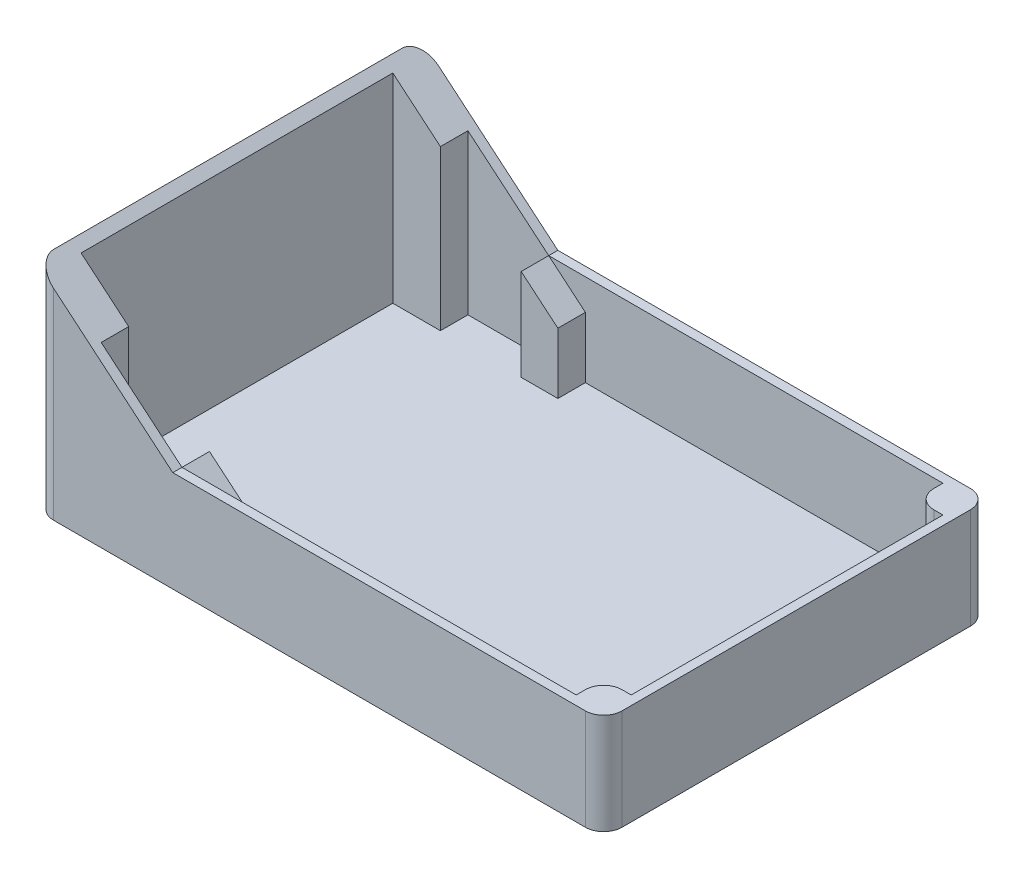
ISO-10303-21;
HEADER;
FILE_DESCRIPTION(('STEP AP214'),'2;1');
FILE_NAME('part.step','',(''),(''),'','','');
FILE_SCHEMA(('AUTOMOTIVE_DESIGN { 1 0 10303 214 1 1 1 1 }'));
ENDSEC;
DATA;
#1=APPLICATION_CONTEXT('core data for automotive mechanical design processes');
#2=APPLICATION_PROTOCOL_DEFINITION('international standard','automotive_design',2000,#1);
#3=PRODUCT_CONTEXT('',#1,'mechanical');
#4=PRODUCT('Part','Part','',(#3));
#5=PRODUCT_RELATED_PRODUCT_CATEGORY('part','',(#4));
#6=PRODUCT_DEFINITION_FORMATION('','',#4);
#7=PRODUCT_DEFINITION_CONTEXT('part definition',#1,'design');
#8=PRODUCT_DEFINITION('design','',#6,#7);
#9=PRODUCT_DEFINITION_SHAPE('','',#8);
#10=(LENGTH_UNIT() NAMED_UNIT(*) SI_UNIT(.MILLI.,.METRE.));
#11=(NAMED_UNIT(*) PLANE_ANGLE_UNIT() SI_UNIT($,.RADIAN.));
#12=(NAMED_UNIT(*) SI_UNIT($,.STERADIAN.) SOLID_ANGLE_UNIT());
#13=UNCERTAINTY_MEASURE_WITH_UNIT(LENGTH_MEASURE(1.E-05),#10,'distance_accuracy_value','');
#14=(GEOMETRIC_REPRESENTATION_CONTEXT(3) GLOBAL_UNCERTAINTY_ASSIGNED_CONTEXT((#13)) GLOBAL_UNIT_ASSIGNED_CONTEXT((#10,
#11,#12)) REPRESENTATION_CONTEXT('',''));
#15=CARTESIAN_POINT('',(0.,0.,0.));
#16=DIRECTION('',(0.,0.,1.));
#17=DIRECTION('',(1.,0.,0.));
#18=AXIS2_PLACEMENT_3D('',#15,#16,#17);
#19=CARTESIAN_POINT('',(0.,0.,-34.));
#20=DIRECTION('',(0.,0.,-1.));
#21=DIRECTION('',(-1.,0.,0.));
#22=AXIS2_PLACEMENT_3D('',#19,#20,#21);
#23=PLANE('',#22);
#24=DIRECTION('',(0.766044443118981,-0.642787609686535,0.));
#25=VECTOR('',#24,1.);
#26=CARTESIAN_POINT('',(-62.,45.1729889353181,-34.));
#27=LINE('',#26,#25);
#28=CARTESIAN_POINT('',(-60.,43.4947896729635,-34.));
#29=VERTEX_POINT('',#28);
#30=CARTESIAN_POINT('',(-49.6190221917366,34.7841150227903,-34.));
#31=VERTEX_POINT('',#30);
#32=EDGE_CURVE('E361',#29,#31,#27,.T.);
#33=ORIENTED_EDGE('',*,*,#32,.F.);
#34=DIRECTION('',(0.,1.,0.));
#35=VECTOR('',#34,1.);
#36=CARTESIAN_POINT('',(-60.,20.,-34.));
#37=LINE('',#36,#35);
#38=CARTESIAN_POINT('',(-60.,0.,-34.));
#39=VERTEX_POINT('',#38);
#40=EDGE_CURVE('E371',#39,#29,#37,.T.);
#41=ORIENTED_EDGE('',*,*,#40,.F.);
#42=DIRECTION('',(1.,0.,0.));
#43=VECTOR('',#42,1.);
#44=CARTESIAN_POINT('',(0.,0.,-34.));
#45=LINE('',#44,#43);
#46=CARTESIAN_POINT('',(-49.6190221917366,0.,-34.));
#47=VERTEX_POINT('',#46);
#48=EDGE_CURVE('E374',#39,#47,#45,.T.);
#49=ORIENTED_EDGE('',*,*,#48,.T.);
#50=DIRECTION('',(0.,-1.,0.));
#51=VECTOR('',#50,1.);
#52=CARTESIAN_POINT('',(-49.6190221917366,34.7841150227903,-34.));
#53=LINE('',#52,#51);
#54=EDGE_CURVE('E357',#31,#47,#53,.T.);
#55=ORIENTED_EDGE('',*,*,#54,.F.);
#56=EDGE_LOOP('',(#33,#41,#49,#55));
#57=FACE_BOUND('',#56,.T.);
#58=ADVANCED_FACE('F62',(#57),#23,.F.);
#59=CARTESIAN_POINT('',(0.,0.,34.));
#60=DIRECTION('',(0.,0.,1.));
#61=DIRECTION('',(-1.,0.,0.));
#62=AXIS2_PLACEMENT_3D('',#59,#60,#61);
#63=PLANE('',#62);
#64=DIRECTION('',(0.,-1.,0.));
#65=VECTOR('',#64,1.);
#66=CARTESIAN_POINT('',(-60.,20.,34.));
#67=LINE('',#66,#65);
#68=CARTESIAN_POINT('',(-60.,43.4947896729635,34.));
#69=VERTEX_POINT('',#68);
#70=CARTESIAN_POINT('',(-60.,0.,34.));
#71=VERTEX_POINT('',#70);
#72=EDGE_CURVE('E273',#69,#71,#67,.T.);
#73=ORIENTED_EDGE('',*,*,#72,.F.);
#74=DIRECTION('',(0.766044443118981,-0.642787609686535,0.));
#75=VECTOR('',#74,1.);
#76=CARTESIAN_POINT('',(-62.,45.1729889353181,34.));
#77=LINE('',#76,#75);
#78=CARTESIAN_POINT('',(-49.6190221917366,34.7841150227903,34.));
#79=VERTEX_POINT('',#78);
#80=EDGE_CURVE('E267',#69,#79,#77,.T.);
#81=ORIENTED_EDGE('',*,*,#80,.T.);
#82=DIRECTION('',(0.,-1.,0.));
#83=VECTOR('',#82,1.);
#84=CARTESIAN_POINT('',(-49.6190221917366,34.7841150227903,34.));
#85=LINE('',#84,#83);
#86=CARTESIAN_POINT('',(-49.6190221917366,0.,34.));
#87=VERTEX_POINT('',#86);
#88=EDGE_CURVE('E272',#79,#87,#85,.T.);
#89=ORIENTED_EDGE('',*,*,#88,.T.);
#90=DIRECTION('',(-1.,0.,0.));
#91=VECTOR('',#90,1.);
#92=CARTESIAN_POINT('',(0.,0.,34.));
#93=LINE('',#92,#91);
#94=EDGE_CURVE('E287',#87,#71,#93,.T.);
#95=ORIENTED_EDGE('',*,*,#94,.T.);
#96=EDGE_LOOP('',(#73,#81,#89,#95));
#97=FACE_BOUND('',#96,.T.);
#98=ADVANCED_FACE('F269',(#97),#63,.F.);
#99=CARTESIAN_POINT('',(-60.,20.,40.));
#100=DIRECTION('',(0.,0.,-1.));
#101=DIRECTION('',(-1.,0.,0.));
#102=AXIS2_PLACEMENT_3D('',#99,#100,#101);
#103=PLANE('',#102);
#104=DIRECTION('',(1.,0.,0.));
#105=VECTOR('',#104,1.);
#106=CARTESIAN_POINT('',(-60.,0.,40.));
#107=LINE('',#106,#105);
#108=CARTESIAN_POINT('',(-49.6190221917366,0.,40.));
#109=VERTEX_POINT('',#108);
#110=CARTESIAN_POINT('',(-32.,0.,40.));
#111=VERTEX_POINT('',#110);
#112=EDGE_CURVE('E500',#109,#111,#107,.T.);
#113=ORIENTED_EDGE('',*,*,#112,.F.);
#114=DIRECTION('',(0.,-1.,0.));
#115=VECTOR('',#114,1.);
#116=CARTESIAN_POINT('',(-49.6190221917366,34.7841150227903,40.));
#117=LINE('',#116,#115);
#118=CARTESIAN_POINT('',(-49.6190221917366,34.7841150227903,40.));
#119=VERTEX_POINT('',#118);
#120=EDGE_CURVE('E293',#119,#109,#117,.T.);
#121=ORIENTED_EDGE('',*,*,#120,.F.);
#122=DIRECTION('',(0.766044443118982,-0.642787609686535,0.));
#123=VECTOR('',#122,1.);
#124=CARTESIAN_POINT('',(-62.,45.1729889353181,40.));
#125=LINE('',#124,#123);
#126=CARTESIAN_POINT('',(-32.,20.,40.));
#127=VERTEX_POINT('',#126);
#128=EDGE_CURVE('E282',#119,#127,#125,.T.);
#129=ORIENTED_EDGE('',*,*,#128,.T.);
#130=DIRECTION('',(0.,-1.,0.));
#131=VECTOR('',#130,1.);
#132=CARTESIAN_POINT('',(-32.,20.,40.));
#133=LINE('',#132,#131);
#134=EDGE_CURVE('E315',#127,#111,#133,.T.);
#135=ORIENTED_EDGE('',*,*,#134,.T.);
#136=EDGE_LOOP('',(#113,#121,#129,#135));
#137=FACE_BOUND('',#136,.T.);
#138=ADVANCED_FACE('F732',(#137),#103,.T.);
#139=CARTESIAN_POINT('',(-60.,20.,-40.));
#140=DIRECTION('',(1.,0.,0.));
#141=DIRECTION('',(0.,0.,-1.));
#142=AXIS2_PLACEMENT_3D('',#139,#140,#141);
#143=PLANE('',#142);
#144=ORIENTED_EDGE('',*,*,#40,.T.);
#145=DIRECTION('',(0.,0.,-1.));
#146=VECTOR('',#145,1.);
#147=CARTESIAN_POINT('',(-60.,43.4947896729635,59.252314189746));
#148=LINE('',#147,#146);
#149=EDGE_CURVE('E296',#69,#29,#148,.T.);
#150=ORIENTED_EDGE('',*,*,#149,.F.);
#151=ORIENTED_EDGE('',*,*,#72,.T.);
#152=DIRECTION('',(0.,0.,1.));
#153=VECTOR('',#152,1.);
#154=CARTESIAN_POINT('',(-60.,0.,-40.));
#155=LINE('',#154,#153);
#156=EDGE_CURVE('E516',#39,#71,#155,.T.);
#157=ORIENTED_EDGE('',*,*,#156,.F.);
#158=EDGE_LOOP('',(#144,#150,#151,#157));
#159=FACE_BOUND('',#158,.T.);
#160=ADVANCED_FACE('F763',(#159),#143,.T.);
#161=CARTESIAN_POINT('',(0.,0.,0.));
#162=DIRECTION('',(0.,-1.,0.));
#163=DIRECTION('',(0.,0.,-1.));
#164=AXIS2_PLACEMENT_3D('',#161,#162,#163);
#165=PLANE('',#164);
#166=DIRECTION('',(0.,0.,-1.));
#167=VECTOR('',#166,1.);
#168=CARTESIAN_POINT('',(-49.6190221917366,0.,0.));
#169=LINE('',#168,#167);
#170=EDGE_CURVE('E291',#109,#87,#169,.T.);
#171=ORIENTED_EDGE('',*,*,#170,.F.);
#172=ORIENTED_EDGE('',*,*,#112,.T.);
#173=DIRECTION('',(0.,0.,-1.));
#174=VECTOR('',#173,1.);
#175=CARTESIAN_POINT('',(-32.,0.,0.));
#176=LINE('',#175,#174);
#177=CARTESIAN_POINT('',(-32.,0.,34.));
#178=VERTEX_POINT('',#177);
#179=EDGE_CURVE('E353',#111,#178,#176,.T.);
#180=ORIENTED_EDGE('',*,*,#179,.T.);
#181=DIRECTION('',(-1.,0.,0.));
#182=VECTOR('',#181,1.);
#183=CARTESIAN_POINT('',(0.,0.,34.));
#184=LINE('',#183,#182);
#185=CARTESIAN_POINT('',(-24.,0.,34.));
#186=VERTEX_POINT('',#185);
#187=EDGE_CURVE('E345',#186,#178,#184,.T.);
#188=ORIENTED_EDGE('',*,*,#187,.F.);
#189=DIRECTION('',(0.,0.,1.));
#190=VECTOR('',#189,1.);
#191=CARTESIAN_POINT('',(-24.,0.,0.));
#192=LINE('',#191,#190);
#193=CARTESIAN_POINT('',(-24.,0.,40.));
#194=VERTEX_POINT('',#193);
#195=EDGE_CURVE('E349',#186,#194,#192,.T.);
#196=ORIENTED_EDGE('',*,*,#195,.T.);
#197=CARTESIAN_POINT('',(54.,0.,40.));
#198=VERTEX_POINT('',#197);
#199=EDGE_CURVE('E520',#194,#198,#107,.T.);
#200=ORIENTED_EDGE('',*,*,#199,.T.);
#201=DIRECTION('',(0.,0.,1.));
#202=VECTOR('',#201,1.);
#203=CARTESIAN_POINT('',(54.,0.,40.));
#204=LINE('',#203,#202);
#205=CARTESIAN_POINT('',(54.,0.,38.));
#206=VERTEX_POINT('',#205);
#207=EDGE_CURVE('E405',#206,#198,#204,.T.);
#208=ORIENTED_EDGE('',*,*,#207,.F.);
#209=CARTESIAN_POINT('',(58.,0.,38.));
#210=DIRECTION('',(0.,-1.,0.));
#211=DIRECTION('',(0.,0.,-1.));
#212=AXIS2_PLACEMENT_3D('',#209,#210,#211);
#213=CIRCLE('',#212,4.);
#214=CARTESIAN_POINT('',(58.,0.,34.));
#215=VERTEX_POINT('',#214);
#216=EDGE_CURVE('E12',#206,#215,#213,.T.);
#217=ORIENTED_EDGE('',*,*,#216,.T.);
#218=DIRECTION('',(-1.,0.,0.));
#219=VECTOR('',#218,1.);
#220=CARTESIAN_POINT('',(60.,0.,34.));
#221=LINE('',#220,#219);
#222=CARTESIAN_POINT('',(60.,0.,34.));
#223=VERTEX_POINT('',#222);
#224=EDGE_CURVE('E398',#223,#215,#221,.T.);
#225=ORIENTED_EDGE('',*,*,#224,.F.);
#226=DIRECTION('',(0.,0.,-1.));
#227=VECTOR('',#226,1.);
#228=CARTESIAN_POINT('',(60.,0.,-40.));
#229=LINE('',#228,#227);
#230=CARTESIAN_POINT('',(60.,0.,-34.));
#231=VERTEX_POINT('',#230);
#232=EDGE_CURVE('E494',#223,#231,#229,.T.);
#233=ORIENTED_EDGE('',*,*,#232,.T.);
#234=DIRECTION('',(1.,0.,0.));
#235=VECTOR('',#234,1.);
#236=CARTESIAN_POINT('',(60.,0.,-34.));
#237=LINE('',#236,#235);
#238=CARTESIAN_POINT('',(58.,0.,-34.));
#239=VERTEX_POINT('',#238);
#240=EDGE_CURVE('E423',#239,#231,#237,.T.);
#241=ORIENTED_EDGE('',*,*,#240,.F.);
#242=CARTESIAN_POINT('',(58.,0.,-38.));
#243=DIRECTION('',(0.,-1.,0.));
#244=DIRECTION('',(0.,0.,-1.));
#245=AXIS2_PLACEMENT_3D('',#242,#243,#244);
#246=CIRCLE('',#245,4.);
#247=CARTESIAN_POINT('',(54.,0.,-38.));
#248=VERTEX_POINT('',#247);
#249=EDGE_CURVE('E71',#239,#248,#246,.T.);
#250=ORIENTED_EDGE('',*,*,#249,.T.);
#251=DIRECTION('',(0.,0.,1.));
#252=VECTOR('',#251,1.);
#253=CARTESIAN_POINT('',(54.,0.,-40.));
#254=LINE('',#253,#252);
#255=CARTESIAN_POINT('',(54.,0.,-40.));
#256=VERTEX_POINT('',#255);
#257=EDGE_CURVE('E427',#256,#248,#254,.T.);
#258=ORIENTED_EDGE('',*,*,#257,.F.);
#259=DIRECTION('',(-1.,0.,0.));
#260=VECTOR('',#259,1.);
#261=CARTESIAN_POINT('',(-60.,0.,-40.));
#262=LINE('',#261,#260);
#263=CARTESIAN_POINT('',(-24.,0.,-40.));
#264=VERTEX_POINT('',#263);
#265=EDGE_CURVE('E513',#256,#264,#262,.T.);
#266=ORIENTED_EDGE('',*,*,#265,.T.);
#267=DIRECTION('',(0.,0.,-1.));
#268=VECTOR('',#267,1.);
#269=CARTESIAN_POINT('',(-24.,0.,0.));
#270=LINE('',#269,#268);
#271=CARTESIAN_POINT('',(-24.,0.,-34.));
#272=VERTEX_POINT('',#271);
#273=EDGE_CURVE('E470',#272,#264,#270,.T.);
#274=ORIENTED_EDGE('',*,*,#273,.F.);
#275=DIRECTION('',(1.,0.,0.));
#276=VECTOR('',#275,1.);
#277=CARTESIAN_POINT('',(0.,0.,-34.));
#278=LINE('',#277,#276);
#279=CARTESIAN_POINT('',(-32.,0.,-34.));
#280=VERTEX_POINT('',#279);
#281=EDGE_CURVE('E466',#280,#272,#278,.T.);
#282=ORIENTED_EDGE('',*,*,#281,.F.);
#283=DIRECTION('',(0.,0.,1.));
#284=VECTOR('',#283,1.);
#285=CARTESIAN_POINT('',(-32.,0.,0.));
#286=LINE('',#285,#284);
#287=CARTESIAN_POINT('',(-32.,0.,-40.));
#288=VERTEX_POINT('',#287);
#289=EDGE_CURVE('E474',#288,#280,#286,.T.);
#290=ORIENTED_EDGE('',*,*,#289,.F.);
#291=CARTESIAN_POINT('',(-49.6190221917366,0.,-40.));
#292=VERTEX_POINT('',#291);
#293=EDGE_CURVE('E512',#288,#292,#262,.T.);
#294=ORIENTED_EDGE('',*,*,#293,.T.);
#295=DIRECTION('',(0.,0.,1.));
#296=VECTOR('',#295,1.);
#297=CARTESIAN_POINT('',(-49.6190221917366,0.,0.));
#298=LINE('',#297,#296);
#299=EDGE_CURVE('E377',#292,#47,#298,.T.);
#300=ORIENTED_EDGE('',*,*,#299,.T.);
#301=ORIENTED_EDGE('',*,*,#48,.F.);
#302=ORIENTED_EDGE('',*,*,#156,.T.);
#303=ORIENTED_EDGE('',*,*,#94,.F.);
#304=EDGE_LOOP('',(#171,#172,#180,#188,#196,#200,#208,#217,#225,#233,#241,#250,#258,#266,#274,
#282,#290,#294,#300,#301,#302,#303));
#305=FACE_BOUND('',#304,.T.);
#306=ADVANCED_FACE('F607',(#305),#165,.F.);
#307=CARTESIAN_POINT('',(0.,20.,0.));
#308=DIRECTION('',(0.,1.,0.));
#309=DIRECTION('',(0.,0.,1.));
#310=AXIS2_PLACEMENT_3D('',#307,#308,#309);
#311=PLANE('',#310);
#312=DIRECTION('',(0.,0.,1.));
#313=VECTOR('',#312,1.);
#314=CARTESIAN_POINT('',(54.,20.,-40.));
#315=LINE('',#314,#313);
#316=CARTESIAN_POINT('',(54.,20.,-40.));
#317=VERTEX_POINT('',#316);
#318=CARTESIAN_POINT('',(54.,20.,-38.));
#319=VERTEX_POINT('',#318);
#320=EDGE_CURVE('E415',#317,#319,#315,.T.);
#321=ORIENTED_EDGE('',*,*,#320,.T.);
#322=CARTESIAN_POINT('',(58.,20.,-38.));
#323=DIRECTION('',(0.,1.,0.));
#324=DIRECTION('',(0.,0.,1.));
#325=AXIS2_PLACEMENT_3D('',#322,#323,#324);
#326=CIRCLE('',#325,4.);
#327=CARTESIAN_POINT('',(58.,20.,-34.));
#328=VERTEX_POINT('',#327);
#329=EDGE_CURVE('E547',#319,#328,#326,.T.);
#330=ORIENTED_EDGE('',*,*,#329,.T.);
#331=DIRECTION('',(1.,0.,0.));
#332=VECTOR('',#331,1.);
#333=CARTESIAN_POINT('',(60.,20.,-34.));
#334=LINE('',#333,#332);
#335=CARTESIAN_POINT('',(60.,20.,-34.));
#336=VERTEX_POINT('',#335);
#337=EDGE_CURVE('E416',#328,#336,#334,.T.);
#338=ORIENTED_EDGE('',*,*,#337,.T.);
#339=DIRECTION('',(0.,0.,-1.));
#340=VECTOR('',#339,1.);
#341=CARTESIAN_POINT('',(60.,20.,-40.));
#342=LINE('',#341,#340);
#343=CARTESIAN_POINT('',(60.,20.,34.));
#344=VERTEX_POINT('',#343);
#345=EDGE_CURVE('E495',#344,#336,#342,.T.);
#346=ORIENTED_EDGE('',*,*,#345,.F.);
#347=DIRECTION('',(-1.,0.,0.));
#348=VECTOR('',#347,1.);
#349=CARTESIAN_POINT('',(60.,20.,34.));
#350=LINE('',#349,#348);
#351=CARTESIAN_POINT('',(58.,20.,34.));
#352=VERTEX_POINT('',#351);
#353=EDGE_CURVE('E392',#344,#352,#350,.T.);
#354=ORIENTED_EDGE('',*,*,#353,.T.);
#355=CARTESIAN_POINT('',(58.,20.,38.));
#356=DIRECTION('',(0.,1.,0.));
#357=DIRECTION('',(0.,0.,1.));
#358=AXIS2_PLACEMENT_3D('',#355,#356,#357);
#359=CIRCLE('',#358,4.);
#360=CARTESIAN_POINT('',(54.,20.,38.));
#361=VERTEX_POINT('',#360);
#362=EDGE_CURVE('E544',#352,#361,#359,.T.);
#363=ORIENTED_EDGE('',*,*,#362,.T.);
#364=DIRECTION('',(0.,0.,1.));
#365=VECTOR('',#364,1.);
#366=CARTESIAN_POINT('',(54.,20.,40.));
#367=LINE('',#366,#365);
#368=CARTESIAN_POINT('',(54.,20.,40.));
#369=VERTEX_POINT('',#368);
#370=EDGE_CURVE('E395',#361,#369,#367,.T.);
#371=ORIENTED_EDGE('',*,*,#370,.T.);
#372=DIRECTION('',(1.,0.,0.));
#373=VECTOR('',#372,1.);
#374=CARTESIAN_POINT('',(-60.,20.,40.));
#375=LINE('',#374,#373);
#376=EDGE_CURVE('E504',#127,#369,#375,.T.);
#377=ORIENTED_EDGE('',*,*,#376,.F.);
#378=DIRECTION('',(0.,0.,1.));
#379=VECTOR('',#378,1.);
#380=CARTESIAN_POINT('',(-32.,20.,40.));
#381=LINE('',#380,#379);
#382=CARTESIAN_POINT('',(-32.,20.,42.));
#383=VERTEX_POINT('',#382);
#384=EDGE_CURVE('E309',#127,#383,#381,.T.);
#385=ORIENTED_EDGE('',*,*,#384,.T.);
#386=DIRECTION('',(1.,0.,0.));
#387=VECTOR('',#386,1.);
#388=CARTESIAN_POINT('',(-60.,20.,42.));
#389=LINE('',#388,#387);
#390=CARTESIAN_POINT('',(58.,20.,42.));
#391=VERTEX_POINT('',#390);
#392=EDGE_CURVE('E530',#383,#391,#389,.T.);
#393=ORIENTED_EDGE('',*,*,#392,.T.);
#394=CARTESIAN_POINT('',(58.,20.,38.));
#395=DIRECTION('',(0.,1.,0.));
#396=DIRECTION('',(0.,0.,1.));
#397=AXIS2_PLACEMENT_3D('',#394,#395,#396);
#398=CIRCLE('',#397,4.);
#399=CARTESIAN_POINT('',(62.,20.,38.));
#400=VERTEX_POINT('',#399);
#401=EDGE_CURVE('E538',#391,#400,#398,.T.);
#402=ORIENTED_EDGE('',*,*,#401,.T.);
#403=DIRECTION('',(0.,0.,-1.));
#404=VECTOR('',#403,1.);
#405=CARTESIAN_POINT('',(62.,20.,-40.));
#406=LINE('',#405,#404);
#407=CARTESIAN_POINT('',(62.,20.,-38.));
#408=VERTEX_POINT('',#407);
#409=EDGE_CURVE('E508',#400,#408,#406,.T.);
#410=ORIENTED_EDGE('',*,*,#409,.T.);
#411=CARTESIAN_POINT('',(58.,20.,-38.));
#412=DIRECTION('',(0.,1.,0.));
#413=DIRECTION('',(0.,0.,1.));
#414=AXIS2_PLACEMENT_3D('',#411,#412,#413);
#415=CIRCLE('',#414,4.);
#416=CARTESIAN_POINT('',(58.,20.,-42.));
#417=VERTEX_POINT('',#416);
#418=EDGE_CURVE('E541',#408,#417,#415,.T.);
#419=ORIENTED_EDGE('',*,*,#418,.T.);
#420=DIRECTION('',(-1.,0.,0.));
#421=VECTOR('',#420,1.);
#422=CARTESIAN_POINT('',(-60.,20.,-42.));
#423=LINE('',#422,#421);
#424=CARTESIAN_POINT('',(-32.,20.,-42.));
#425=VERTEX_POINT('',#424);
#426=EDGE_CURVE('E526',#417,#425,#423,.T.);
#427=ORIENTED_EDGE('',*,*,#426,.T.);
#428=DIRECTION('',(0.,0.,-1.));
#429=VECTOR('',#428,1.);
#430=CARTESIAN_POINT('',(-32.,20.,-40.));
#431=LINE('',#430,#429);
#432=CARTESIAN_POINT('',(-32.,20.,-40.));
#433=VERTEX_POINT('',#432);
#434=EDGE_CURVE('E388',#433,#425,#431,.T.);
#435=ORIENTED_EDGE('',*,*,#434,.F.);
#436=DIRECTION('',(-1.,0.,0.));
#437=VECTOR('',#436,1.);
#438=CARTESIAN_POINT('',(-60.,20.,-40.));
#439=LINE('',#438,#437);
#440=EDGE_CURVE('E499',#317,#433,#439,.T.);
#441=ORIENTED_EDGE('',*,*,#440,.F.);
#442=EDGE_LOOP('',(#321,#330,#338,#346,#354,#363,#371,#377,#385,#393,#402,#410,#419,#427,#435,#441));
#443=FACE_BOUND('',#442,.T.);
#444=ADVANCED_FACE('F619',(#443),#311,.T.);
#445=CARTESIAN_POINT('',(-60.,20.,-40.));
#446=DIRECTION('',(0.,0.,1.));
#447=DIRECTION('',(1.,0.,0.));
#448=AXIS2_PLACEMENT_3D('',#445,#446,#447);
#449=PLANE('',#448);
#450=DIRECTION('',(0.,-1.,0.));
#451=VECTOR('',#450,1.);
#452=CARTESIAN_POINT('',(-49.6190221917366,34.7841150227903,-40.));
#453=LINE('',#452,#451);
#454=CARTESIAN_POINT('',(-49.6190221917366,34.7841150227903,-40.));
#455=VERTEX_POINT('',#454);
#456=EDGE_CURVE('E356',#455,#292,#453,.T.);
#457=ORIENTED_EDGE('',*,*,#456,.T.);
#458=ORIENTED_EDGE('',*,*,#293,.F.);
#459=DIRECTION('',(0.,-1.,0.));
#460=VECTOR('',#459,1.);
#461=CARTESIAN_POINT('',(-32.,20.,-40.));
#462=LINE('',#461,#460);
#463=EDGE_CURVE('E434',#433,#288,#462,.T.);
#464=ORIENTED_EDGE('',*,*,#463,.F.);
#465=DIRECTION('',(0.766044443118982,-0.642787609686535,0.));
#466=VECTOR('',#465,1.);
#467=CARTESIAN_POINT('',(-62.,45.1729889353181,-40.));
#468=LINE('',#467,#466);
#469=EDGE_CURVE('E382',#455,#433,#468,.T.);
#470=ORIENTED_EDGE('',*,*,#469,.F.);
#471=EDGE_LOOP('',(#457,#458,#464,#470));
#472=FACE_BOUND('',#471,.T.);
#473=ADVANCED_FACE('F687',(#472),#449,.T.);
#474=DIRECTION('',(0.,1.,0.));
#475=VECTOR('',#474,1.);
#476=CARTESIAN_POINT('',(54.,-8.48528137423857,-40.));
#477=LINE('',#476,#475);
#478=EDGE_CURVE('E419',#256,#317,#477,.T.);
#479=ORIENTED_EDGE('',*,*,#478,.T.);
#480=ORIENTED_EDGE('',*,*,#440,.T.);
#481=DIRECTION('',(-0.766044443118982,0.642787609686535,0.));
#482=VECTOR('',#481,1.);
#483=CARTESIAN_POINT('',(-32.,20.,-40.));
#484=LINE('',#483,#482);
#485=CARTESIAN_POINT('',(-24.,13.2872029505818,-40.));
#486=VERTEX_POINT('',#485);
#487=EDGE_CURVE('E442',#486,#433,#484,.T.);
#488=ORIENTED_EDGE('',*,*,#487,.F.);
#489=DIRECTION('',(0.,1.,0.));
#490=VECTOR('',#489,1.);
#491=CARTESIAN_POINT('',(-24.,13.2872029505818,-40.));
#492=LINE('',#491,#490);
#493=EDGE_CURVE('E452',#264,#486,#492,.T.);
#494=ORIENTED_EDGE('',*,*,#493,.F.);
#495=ORIENTED_EDGE('',*,*,#265,.F.);
#496=EDGE_LOOP('',(#479,#480,#488,#494,#495));
#497=FACE_BOUND('',#496,.T.);
#498=ADVANCED_FACE('F705',(#497),#449,.T.);
#499=CARTESIAN_POINT('',(62.,20.,-40.));
#500=DIRECTION('',(-1.,0.,0.));
#501=DIRECTION('',(0.,0.,1.));
#502=AXIS2_PLACEMENT_3D('',#499,#500,#501);
#503=PLANE('',#502);
#504=DIRECTION('',(0.,0.,1.));
#505=VECTOR('',#504,1.);
#506=CARTESIAN_POINT('',(62.,-2.,-42.));
#507=LINE('',#506,#505);
#508=CARTESIAN_POINT('',(62.,-2.,-38.));
#509=VERTEX_POINT('',#508);
#510=CARTESIAN_POINT('',(62.,-2.,38.));
#511=VERTEX_POINT('',#510);
#512=EDGE_CURVE('E482',#509,#511,#507,.T.);
#513=ORIENTED_EDGE('',*,*,#512,.F.);
#514=DIRECTION('',(0.,-1.,0.));
#515=VECTOR('',#514,1.);
#516=CARTESIAN_POINT('',(62.,20.,-38.));
#517=LINE('',#516,#515);
#518=EDGE_CURVE('E601',#509,#408,#517,.F.);
#519=ORIENTED_EDGE('',*,*,#518,.T.);
#520=ORIENTED_EDGE('',*,*,#409,.F.);
#521=DIRECTION('',(0.,-1.,0.));
#522=VECTOR('',#521,1.);
#523=CARTESIAN_POINT('',(62.,20.,38.));
#524=LINE('',#523,#522);
#525=EDGE_CURVE('E597',#400,#511,#524,.T.);
#526=ORIENTED_EDGE('',*,*,#525,.T.);
#527=EDGE_LOOP('',(#513,#519,#520,#526));
#528=FACE_BOUND('',#527,.T.);
#529=ADVANCED_FACE('F672',(#528),#503,.F.);
#530=CARTESIAN_POINT('',(-60.,20.,-42.));
#531=DIRECTION('',(0.,0.,1.));
#532=DIRECTION('',(1.,0.,0.));
#533=AXIS2_PLACEMENT_3D('',#530,#531,#532);
#534=PLANE('',#533);
#535=DIRECTION('',(1.,0.,0.));
#536=VECTOR('',#535,1.);
#537=CARTESIAN_POINT('',(-62.,-2.,-42.));
#538=LINE('',#537,#536);
#539=CARTESIAN_POINT('',(-58.,-2.,-42.));
#540=VERTEX_POINT('',#539);
#541=CARTESIAN_POINT('',(58.,-2.,-42.));
#542=VERTEX_POINT('',#541);
#543=EDGE_CURVE('E478',#540,#542,#538,.T.);
#544=ORIENTED_EDGE('',*,*,#543,.F.);
#545=DIRECTION('',(0.,-1.,0.));
#546=VECTOR('',#545,1.);
#547=CARTESIAN_POINT('',(-58.,20.,-42.));
#548=LINE('',#547,#546);
#549=CARTESIAN_POINT('',(-58.,41.816590410609,-42.));
#550=VERTEX_POINT('',#549);
#551=EDGE_CURVE('E78',#540,#550,#548,.F.);
#552=ORIENTED_EDGE('',*,*,#551,.T.);
#553=DIRECTION('',(0.766044443118982,-0.642787609686535,0.));
#554=VECTOR('',#553,1.);
#555=CARTESIAN_POINT('',(-62.,45.1729889353181,-42.));
#556=LINE('',#555,#554);
#557=EDGE_CURVE('E381',#550,#425,#556,.T.);
#558=ORIENTED_EDGE('',*,*,#557,.T.);
#559=ORIENTED_EDGE('',*,*,#426,.F.);
#560=DIRECTION('',(0.,-1.,0.));
#561=VECTOR('',#560,1.);
#562=CARTESIAN_POINT('',(58.,20.,-42.));
#563=LINE('',#562,#561);
#564=EDGE_CURVE('E591',#417,#542,#563,.T.);
#565=ORIENTED_EDGE('',*,*,#564,.T.);
#566=EDGE_LOOP('',(#544,#552,#558,#559,#565));
#567=FACE_BOUND('',#566,.T.);
#568=ADVANCED_FACE('F681',(#567),#534,.F.);
#569=CARTESIAN_POINT('',(-62.,20.,-40.));
#570=DIRECTION('',(1.,0.,0.));
#571=DIRECTION('',(0.,0.,-1.));
#572=AXIS2_PLACEMENT_3D('',#569,#570,#571);
#573=PLANE('',#572);
#574=DIRECTION('',(0.,0.,-1.));
#575=VECTOR('',#574,1.);
#576=CARTESIAN_POINT('',(-62.,-2.,42.));
#577=LINE('',#576,#575);
#578=CARTESIAN_POINT('',(-62.,-2.,38.));
#579=VERTEX_POINT('',#578);
#580=CARTESIAN_POINT('',(-62.,-2.,-38.));
#581=VERTEX_POINT('',#580);
#582=EDGE_CURVE('E490',#579,#581,#577,.T.);
#583=ORIENTED_EDGE('',*,*,#582,.F.);
#584=DIRECTION('',(0.,-1.,0.));
#585=VECTOR('',#584,1.);
#586=CARTESIAN_POINT('',(-62.,20.,38.));
#587=LINE('',#586,#585);
#588=CARTESIAN_POINT('',(-62.,45.1729889353181,38.));
#589=VERTEX_POINT('',#588);
#590=EDGE_CURVE('E583',#579,#589,#587,.F.);
#591=ORIENTED_EDGE('',*,*,#590,.T.);
#592=DIRECTION('',(0.,0.,-1.));
#593=VECTOR('',#592,1.);
#594=CARTESIAN_POINT('',(-62.,45.1729889353181,-40.));
#595=LINE('',#594,#593);
#596=CARTESIAN_POINT('',(-62.,45.1729889353181,-38.));
#597=VERTEX_POINT('',#596);
#598=EDGE_CURVE('E385',#589,#597,#595,.T.);
#599=ORIENTED_EDGE('',*,*,#598,.T.);
#600=DIRECTION('',(0.,-1.,0.));
#601=VECTOR('',#600,1.);
#602=CARTESIAN_POINT('',(-62.,20.,-38.));
#603=LINE('',#602,#601);
#604=EDGE_CURVE('E579',#597,#581,#603,.T.);
#605=ORIENTED_EDGE('',*,*,#604,.T.);
#606=EDGE_LOOP('',(#583,#591,#599,#605));
#607=FACE_BOUND('',#606,.T.);
#608=ADVANCED_FACE('F777',(#607),#573,.F.);
#609=CARTESIAN_POINT('',(-60.,20.,42.));
#610=DIRECTION('',(0.,0.,-1.));
#611=DIRECTION('',(-1.,0.,0.));
#612=AXIS2_PLACEMENT_3D('',#609,#610,#611);
#613=PLANE('',#612);
#614=DIRECTION('',(0.766044443118982,-0.642787609686535,0.));
#615=VECTOR('',#614,1.);
#616=CARTESIAN_POINT('',(-62.,45.1729889353181,42.));
#617=LINE('',#616,#615);
#618=CARTESIAN_POINT('',(-58.,41.816590410609,42.));
#619=VERTEX_POINT('',#618);
#620=EDGE_CURVE('E306',#619,#383,#617,.T.);
#621=ORIENTED_EDGE('',*,*,#620,.F.);
#622=DIRECTION('',(0.,-1.,0.));
#623=VECTOR('',#622,1.);
#624=CARTESIAN_POINT('',(-58.,20.,42.));
#625=LINE('',#624,#623);
#626=CARTESIAN_POINT('',(-58.,-2.,42.));
#627=VERTEX_POINT('',#626);
#628=EDGE_CURVE('E563',#619,#627,#625,.T.);
#629=ORIENTED_EDGE('',*,*,#628,.T.);
#630=DIRECTION('',(-1.,0.,0.));
#631=VECTOR('',#630,1.);
#632=CARTESIAN_POINT('',(62.,-2.,42.));
#633=LINE('',#632,#631);
#634=CARTESIAN_POINT('',(58.,-2.,42.));
#635=VERTEX_POINT('',#634);
#636=EDGE_CURVE('E486',#635,#627,#633,.T.);
#637=ORIENTED_EDGE('',*,*,#636,.F.);
#638=DIRECTION('',(0.,-1.,0.));
#639=VECTOR('',#638,1.);
#640=CARTESIAN_POINT('',(58.,20.,42.));
#641=LINE('',#640,#639);
#642=EDGE_CURVE('E560',#635,#391,#641,.F.);
#643=ORIENTED_EDGE('',*,*,#642,.T.);
#644=ORIENTED_EDGE('',*,*,#392,.F.);
#645=EDGE_LOOP('',(#621,#629,#637,#643,#644));
#646=FACE_BOUND('',#645,.T.);
#647=ADVANCED_FACE('F663',(#646),#613,.F.);
#648=CARTESIAN_POINT('',(60.,20.,-40.));
#649=DIRECTION('',(-1.,0.,0.));
#650=DIRECTION('',(0.,0.,1.));
#651=AXIS2_PLACEMENT_3D('',#648,#649,#650);
#652=PLANE('',#651);
#653=DIRECTION('',(0.,1.,0.));
#654=VECTOR('',#653,1.);
#655=CARTESIAN_POINT('',(60.,-8.48528137423857,34.));
#656=LINE('',#655,#654);
#657=EDGE_CURVE('E412',#223,#344,#656,.T.);
#658=ORIENTED_EDGE('',*,*,#657,.T.);
#659=ORIENTED_EDGE('',*,*,#345,.T.);
#660=DIRECTION('',(0.,1.,0.));
#661=VECTOR('',#660,1.);
#662=CARTESIAN_POINT('',(60.,-8.48528137423857,-34.));
#663=LINE('',#662,#661);
#664=EDGE_CURVE('E426',#231,#336,#663,.T.);
#665=ORIENTED_EDGE('',*,*,#664,.F.);
#666=ORIENTED_EDGE('',*,*,#232,.F.);
#667=EDGE_LOOP('',(#658,#659,#665,#666));
#668=FACE_BOUND('',#667,.T.);
#669=ADVANCED_FACE('F627',(#668),#652,.T.);
#670=DIRECTION('',(-0.766044443118982,0.642787609686535,0.));
#671=VECTOR('',#670,1.);
#672=CARTESIAN_POINT('',(-32.,20.,40.));
#673=LINE('',#672,#671);
#674=CARTESIAN_POINT('',(-24.,13.2872029505818,40.));
#675=VERTEX_POINT('',#674);
#676=EDGE_CURVE('E332',#675,#127,#673,.T.);
#677=ORIENTED_EDGE('',*,*,#676,.T.);
#678=ORIENTED_EDGE('',*,*,#376,.T.);
#679=DIRECTION('',(0.,1.,0.));
#680=VECTOR('',#679,1.);
#681=CARTESIAN_POINT('',(54.,-8.48528137423857,40.));
#682=LINE('',#681,#680);
#683=EDGE_CURVE('E408',#198,#369,#682,.T.);
#684=ORIENTED_EDGE('',*,*,#683,.F.);
#685=ORIENTED_EDGE('',*,*,#199,.F.);
#686=DIRECTION('',(0.,1.,0.));
#687=VECTOR('',#686,1.);
#688=CARTESIAN_POINT('',(-24.,13.2872029505818,40.));
#689=LINE('',#688,#687);
#690=EDGE_CURVE('E321',#194,#675,#689,.T.);
#691=ORIENTED_EDGE('',*,*,#690,.T.);
#692=EDGE_LOOP('',(#677,#678,#684,#685,#691));
#693=FACE_BOUND('',#692,.T.);
#694=ADVANCED_FACE('F645',(#693),#103,.T.);
#695=CARTESIAN_POINT('',(0.,-2.,0.));
#696=DIRECTION('',(0.,-1.,0.));
#697=DIRECTION('',(0.,0.,-1.));
#698=AXIS2_PLACEMENT_3D('',#695,#696,#697);
#699=PLANE('',#698);
#700=ORIENTED_EDGE('',*,*,#636,.T.);
#701=CARTESIAN_POINT('',(-58.,-2.,38.));
#702=DIRECTION('',(0.,-1.,0.));
#703=DIRECTION('',(0.,0.,-1.));
#704=AXIS2_PLACEMENT_3D('',#701,#702,#703);
#705=CIRCLE('',#704,4.);
#706=EDGE_CURVE('E576',#627,#579,#705,.T.);
#707=ORIENTED_EDGE('',*,*,#706,.T.);
#708=ORIENTED_EDGE('',*,*,#582,.T.);
#709=CARTESIAN_POINT('',(-58.,-2.,-38.));
#710=DIRECTION('',(0.,-1.,0.));
#711=DIRECTION('',(0.,0.,-1.));
#712=AXIS2_PLACEMENT_3D('',#709,#710,#711);
#713=CIRCLE('',#712,4.);
#714=EDGE_CURVE('E573',#581,#540,#713,.T.);
#715=ORIENTED_EDGE('',*,*,#714,.T.);
#716=ORIENTED_EDGE('',*,*,#543,.T.);
#717=CARTESIAN_POINT('',(58.,-2.,-38.));
#718=DIRECTION('',(0.,-1.,0.));
#719=DIRECTION('',(0.,0.,-1.));
#720=AXIS2_PLACEMENT_3D('',#717,#718,#719);
#721=CIRCLE('',#720,4.);
#722=EDGE_CURVE('E570',#542,#509,#721,.T.);
#723=ORIENTED_EDGE('',*,*,#722,.T.);
#724=ORIENTED_EDGE('',*,*,#512,.T.);
#725=CARTESIAN_POINT('',(58.,-2.,38.));
#726=DIRECTION('',(0.,-1.,0.));
#727=DIRECTION('',(0.,0.,-1.));
#728=AXIS2_PLACEMENT_3D('',#725,#726,#727);
#729=CIRCLE('',#728,4.);
#730=EDGE_CURVE('E567',#511,#635,#729,.T.);
#731=ORIENTED_EDGE('',*,*,#730,.T.);
#732=EDGE_LOOP('',(#700,#707,#708,#715,#716,#723,#724,#731));
#733=FACE_BOUND('',#732,.T.);
#734=ADVANCED_FACE('F675',(#733),#699,.T.);
#735=CARTESIAN_POINT('',(-32.,20.,-34.));
#736=DIRECTION('',(1.,0.,0.));
#737=DIRECTION('',(0.,1.,0.));
#738=AXIS2_PLACEMENT_3D('',#735,#736,#737);
#739=PLANE('',#738);
#740=ORIENTED_EDGE('',*,*,#463,.T.);
#741=ORIENTED_EDGE('',*,*,#289,.T.);
#742=DIRECTION('',(0.,-1.,0.));
#743=VECTOR('',#742,1.);
#744=CARTESIAN_POINT('',(-32.,20.,-34.));
#745=LINE('',#744,#743);
#746=CARTESIAN_POINT('',(-32.,20.,-34.));
#747=VERTEX_POINT('',#746);
#748=EDGE_CURVE('E437',#747,#280,#745,.T.);
#749=ORIENTED_EDGE('',*,*,#748,.F.);
#750=DIRECTION('',(0.,0.,-1.));
#751=VECTOR('',#750,1.);
#752=CARTESIAN_POINT('',(-32.,20.,-34.));
#753=LINE('',#752,#751);
#754=EDGE_CURVE('E448',#747,#433,#753,.T.);
#755=ORIENTED_EDGE('',*,*,#754,.T.);
#756=EDGE_LOOP('',(#740,#741,#749,#755));
#757=FACE_BOUND('',#756,.T.);
#758=ADVANCED_FACE('F699',(#757),#739,.F.);
#759=CARTESIAN_POINT('',(-24.,13.2872029505818,-34.));
#760=DIRECTION('',(-1.,0.,0.));
#761=DIRECTION('',(0.,-1.,0.));
#762=AXIS2_PLACEMENT_3D('',#759,#760,#761);
#763=PLANE('',#762);
#764=DIRECTION('',(0.,1.,0.));
#765=VECTOR('',#764,1.);
#766=CARTESIAN_POINT('',(-24.,13.2872029505818,-34.));
#767=LINE('',#766,#765);
#768=CARTESIAN_POINT('',(-24.,13.2872029505818,-34.));
#769=VERTEX_POINT('',#768);
#770=EDGE_CURVE('E441',#272,#769,#767,.T.);
#771=ORIENTED_EDGE('',*,*,#770,.F.);
#772=ORIENTED_EDGE('',*,*,#273,.T.);
#773=ORIENTED_EDGE('',*,*,#493,.T.);
#774=DIRECTION('',(0.,0.,-1.));
#775=VECTOR('',#774,1.);
#776=CARTESIAN_POINT('',(-24.,13.2872029505818,-34.));
#777=LINE('',#776,#775);
#778=EDGE_CURVE('E462',#769,#486,#777,.T.);
#779=ORIENTED_EDGE('',*,*,#778,.F.);
#780=EDGE_LOOP('',(#771,#772,#773,#779));
#781=FACE_BOUND('',#780,.T.);
#782=ADVANCED_FACE('F704',(#781),#763,.F.);
#783=CARTESIAN_POINT('',(0.,0.,-34.));
#784=DIRECTION('',(0.,0.,-1.));
#785=DIRECTION('',(-1.,0.,0.));
#786=AXIS2_PLACEMENT_3D('',#783,#784,#785);
#787=PLANE('',#786);
#788=ORIENTED_EDGE('',*,*,#748,.T.);
#789=ORIENTED_EDGE('',*,*,#281,.T.);
#790=ORIENTED_EDGE('',*,*,#770,.T.);
#791=DIRECTION('',(-0.766044443118982,0.642787609686535,0.));
#792=VECTOR('',#791,1.);
#793=CARTESIAN_POINT('',(-32.,20.,-34.));
#794=LINE('',#793,#792);
#795=EDGE_CURVE('E445',#769,#747,#794,.T.);
#796=ORIENTED_EDGE('',*,*,#795,.T.);
#797=EDGE_LOOP('',(#788,#789,#790,#796));
#798=FACE_BOUND('',#797,.T.);
#799=ADVANCED_FACE('F701',(#798),#787,.F.);
#800=CARTESIAN_POINT('',(-32.,20.,-34.));
#801=DIRECTION('',(-0.642787609686535,-0.766044443118982,0.));
#802=DIRECTION('',(0.766044443118982,-0.642787609686535,0.));
#803=AXIS2_PLACEMENT_3D('',#800,#801,#802);
#804=PLANE('',#803);
#805=ORIENTED_EDGE('',*,*,#487,.T.);
#806=ORIENTED_EDGE('',*,*,#754,.F.);
#807=ORIENTED_EDGE('',*,*,#795,.F.);
#808=ORIENTED_EDGE('',*,*,#778,.T.);
#809=EDGE_LOOP('',(#805,#806,#807,#808));
#810=FACE_BOUND('',#809,.T.);
#811=ADVANCED_FACE('F693',(#810),#804,.F.);
#812=CARTESIAN_POINT('',(54.,-8.48528137423857,-40.));
#813=DIRECTION('',(-1.,0.,0.));
#814=DIRECTION('',(0.,0.,1.));
#815=AXIS2_PLACEMENT_3D('',#812,#813,#814);
#816=PLANE('',#815);
#817=ORIENTED_EDGE('',*,*,#257,.T.);
#818=DIRECTION('',(0.,1.,0.));
#819=VECTOR('',#818,1.);
#820=CARTESIAN_POINT('',(54.,-8.48528137423857,-38.));
#821=LINE('',#820,#819);
#822=EDGE_CURVE('E534',#248,#319,#821,.T.);
#823=ORIENTED_EDGE('',*,*,#822,.T.);
#824=ORIENTED_EDGE('',*,*,#320,.F.);
#825=ORIENTED_EDGE('',*,*,#478,.F.);
#826=EDGE_LOOP('',(#817,#823,#824,#825));
#827=FACE_BOUND('',#826,.T.);
#828=ADVANCED_FACE('F614',(#827),#816,.T.);
#829=CARTESIAN_POINT('',(60.,-8.48528137423857,-34.));
#830=DIRECTION('',(0.,0.,1.));
#831=DIRECTION('',(1.,0.,0.));
#832=AXIS2_PLACEMENT_3D('',#829,#830,#831);
#833=PLANE('',#832);
#834=ORIENTED_EDGE('',*,*,#337,.F.);
#835=DIRECTION('',(0.,1.,0.));
#836=VECTOR('',#835,1.);
#837=CARTESIAN_POINT('',(58.,-8.48528137423857,-34.));
#838=LINE('',#837,#836);
#839=EDGE_CURVE('E550',#328,#239,#838,.F.);
#840=ORIENTED_EDGE('',*,*,#839,.T.);
#841=ORIENTED_EDGE('',*,*,#240,.T.);
#842=ORIENTED_EDGE('',*,*,#664,.T.);
#843=EDGE_LOOP('',(#834,#840,#841,#842));
#844=FACE_BOUND('',#843,.T.);
#845=ADVANCED_FACE('F623',(#844),#833,.T.);
#846=CARTESIAN_POINT('',(60.,-8.48528137423857,34.));
#847=DIRECTION('',(0.,0.,-1.));
#848=DIRECTION('',(-1.,0.,0.));
#849=AXIS2_PLACEMENT_3D('',#846,#847,#848);
#850=PLANE('',#849);
#851=ORIENTED_EDGE('',*,*,#224,.T.);
#852=DIRECTION('',(0.,1.,0.));
#853=VECTOR('',#852,1.);
#854=CARTESIAN_POINT('',(58.,-8.48528137423857,34.));
#855=LINE('',#854,#853);
#856=EDGE_CURVE('E553',#215,#352,#855,.T.);
#857=ORIENTED_EDGE('',*,*,#856,.T.);
#858=ORIENTED_EDGE('',*,*,#353,.F.);
#859=ORIENTED_EDGE('',*,*,#657,.F.);
#860=EDGE_LOOP('',(#851,#857,#858,#859));
#861=FACE_BOUND('',#860,.T.);
#862=ADVANCED_FACE('F631',(#861),#850,.T.);
#863=CARTESIAN_POINT('',(54.,-8.48528137423857,40.));
#864=DIRECTION('',(-1.,0.,0.));
#865=DIRECTION('',(0.,0.,1.));
#866=AXIS2_PLACEMENT_3D('',#863,#864,#865);
#867=PLANE('',#866);
#868=ORIENTED_EDGE('',*,*,#370,.F.);
#869=DIRECTION('',(0.,1.,0.));
#870=VECTOR('',#869,1.);
#871=CARTESIAN_POINT('',(54.,-8.48528137423857,38.));
#872=LINE('',#871,#870);
#873=EDGE_CURVE('E557',#361,#206,#872,.F.);
#874=ORIENTED_EDGE('',*,*,#873,.T.);
#875=ORIENTED_EDGE('',*,*,#207,.T.);
#876=ORIENTED_EDGE('',*,*,#683,.T.);
#877=EDGE_LOOP('',(#868,#874,#875,#876));
#878=FACE_BOUND('',#877,.T.);
#879=ADVANCED_FACE('F640',(#878),#867,.T.);
#880=CARTESIAN_POINT('',(-62.,45.1729889353181,-40.));
#881=DIRECTION('',(0.642787609686535,0.766044443118982,0.));
#882=DIRECTION('',(-0.766044443118982,0.642787609686535,0.));
#883=AXIS2_PLACEMENT_3D('',#880,#881,#882);
#884=PLANE('',#883);
#885=ORIENTED_EDGE('',*,*,#598,.F.);
#886=CARTESIAN_POINT('',(-58.,41.816590410609,38.));
#887=DIRECTION('',(0.642787609686535,0.766044443118982,0.));
#888=DIRECTION('',(0.766044443118982,-0.642787609686535,0.));
#889=AXIS2_PLACEMENT_3D('',#886,#887,#888);
#890=ELLIPSE('',#889,5.22162915732909,4.);
#891=EDGE_CURVE('E588',#589,#619,#890,.T.);
#892=ORIENTED_EDGE('',*,*,#891,.T.);
#893=ORIENTED_EDGE('',*,*,#620,.T.);
#894=ORIENTED_EDGE('',*,*,#384,.F.);
#895=ORIENTED_EDGE('',*,*,#128,.F.);
#896=DIRECTION('',(0.,0.,1.));
#897=VECTOR('',#896,1.);
#898=CARTESIAN_POINT('',(-49.6190221917366,34.7841150227903,34.));
#899=LINE('',#898,#897);
#900=EDGE_CURVE('E277',#79,#119,#899,.T.);
#901=ORIENTED_EDGE('',*,*,#900,.F.);
#902=ORIENTED_EDGE('',*,*,#80,.F.);
#903=ORIENTED_EDGE('',*,*,#149,.T.);
#904=ORIENTED_EDGE('',*,*,#32,.T.);
#905=DIRECTION('',(0.,0.,-1.));
#906=VECTOR('',#905,1.);
#907=CARTESIAN_POINT('',(-49.6190221917366,34.7841150227903,-34.));
#908=LINE('',#907,#906);
#909=EDGE_CURVE('E364',#31,#455,#908,.T.);
#910=ORIENTED_EDGE('',*,*,#909,.T.);
#911=ORIENTED_EDGE('',*,*,#469,.T.);
#912=ORIENTED_EDGE('',*,*,#434,.T.);
#913=ORIENTED_EDGE('',*,*,#557,.F.);
#914=CARTESIAN_POINT('',(-58.,41.816590410609,-38.));
#915=DIRECTION('',(0.642787609686535,0.766044443118982,0.));
#916=DIRECTION('',(0.766044443118982,-0.642787609686535,0.));
#917=AXIS2_PLACEMENT_3D('',#914,#915,#916);
#918=ELLIPSE('',#917,5.22162915732909,4.);
#919=EDGE_CURVE('E85',#550,#597,#918,.T.);
#920=ORIENTED_EDGE('',*,*,#919,.T.);
#921=EDGE_LOOP('',(#885,#892,#893,#894,#895,#901,#902,#903,#904,#910,#911,#912,#913,#920));
#922=FACE_BOUND('',#921,.T.);
#923=ADVANCED_FACE('F280',(#922),#884,.T.);
#924=CARTESIAN_POINT('',(-49.6190221917366,34.7841150227903,-34.));
#925=DIRECTION('',(1.,0.,0.));
#926=DIRECTION('',(0.,1.,0.));
#927=AXIS2_PLACEMENT_3D('',#924,#925,#926);
#928=PLANE('',#927);
#929=ORIENTED_EDGE('',*,*,#299,.F.);
#930=ORIENTED_EDGE('',*,*,#456,.F.);
#931=ORIENTED_EDGE('',*,*,#909,.F.);
#932=ORIENTED_EDGE('',*,*,#54,.T.);
#933=EDGE_LOOP('',(#929,#930,#931,#932));
#934=FACE_BOUND('',#933,.T.);
#935=ADVANCED_FACE('F737',(#934),#928,.T.);
#936=CARTESIAN_POINT('',(-32.,20.,34.));
#937=DIRECTION('',(-1.,0.,0.));
#938=DIRECTION('',(0.,-1.,0.));
#939=AXIS2_PLACEMENT_3D('',#936,#937,#938);
#940=PLANE('',#939);
#941=ORIENTED_EDGE('',*,*,#179,.F.);
#942=ORIENTED_EDGE('',*,*,#134,.F.);
#943=DIRECTION('',(0.,0.,1.));
#944=VECTOR('',#943,1.);
#945=CARTESIAN_POINT('',(-32.,20.,34.));
#946=LINE('',#945,#944);
#947=CARTESIAN_POINT('',(-32.,20.,34.));
#948=VERTEX_POINT('',#947);
#949=EDGE_CURVE('E341',#948,#127,#946,.T.);
#950=ORIENTED_EDGE('',*,*,#949,.F.);
#951=DIRECTION('',(0.,-1.,0.));
#952=VECTOR('',#951,1.);
#953=CARTESIAN_POINT('',(-32.,20.,34.));
#954=LINE('',#953,#952);
#955=EDGE_CURVE('E316',#948,#178,#954,.T.);
#956=ORIENTED_EDGE('',*,*,#955,.T.);
#957=EDGE_LOOP('',(#941,#942,#950,#956));
#958=FACE_BOUND('',#957,.T.);
#959=ADVANCED_FACE('F655',(#958),#940,.T.);
#960=CARTESIAN_POINT('',(-24.,13.2872029505818,34.));
#961=DIRECTION('',(1.,0.,0.));
#962=DIRECTION('',(0.,1.,0.));
#963=AXIS2_PLACEMENT_3D('',#960,#961,#962);
#964=PLANE('',#963);
#965=ORIENTED_EDGE('',*,*,#195,.F.);
#966=DIRECTION('',(0.,1.,0.));
#967=VECTOR('',#966,1.);
#968=CARTESIAN_POINT('',(-24.,13.2872029505818,34.));
#969=LINE('',#968,#967);
#970=CARTESIAN_POINT('',(-24.,13.2872029505818,34.));
#971=VERTEX_POINT('',#970);
#972=EDGE_CURVE('E325',#186,#971,#969,.T.);
#973=ORIENTED_EDGE('',*,*,#972,.T.);
#974=DIRECTION('',(0.,0.,1.));
#975=VECTOR('',#974,1.);
#976=CARTESIAN_POINT('',(-24.,13.2872029505818,34.));
#977=LINE('',#976,#975);
#978=EDGE_CURVE('E328',#971,#675,#977,.T.);
#979=ORIENTED_EDGE('',*,*,#978,.T.);
#980=ORIENTED_EDGE('',*,*,#690,.F.);
#981=EDGE_LOOP('',(#965,#973,#979,#980));
#982=FACE_BOUND('',#981,.T.);
#983=ADVANCED_FACE('F713',(#982),#964,.T.);
#984=CARTESIAN_POINT('',(0.,0.,34.));
#985=DIRECTION('',(0.,0.,1.));
#986=DIRECTION('',(-1.,0.,0.));
#987=AXIS2_PLACEMENT_3D('',#984,#985,#986);
#988=PLANE('',#987);
#989=ORIENTED_EDGE('',*,*,#972,.F.);
#990=ORIENTED_EDGE('',*,*,#187,.T.);
#991=ORIENTED_EDGE('',*,*,#955,.F.);
#992=DIRECTION('',(-0.766044443118982,0.642787609686535,0.));
#993=VECTOR('',#992,1.);
#994=CARTESIAN_POINT('',(-32.,20.,34.));
#995=LINE('',#994,#993);
#996=EDGE_CURVE('E320',#971,#948,#995,.T.);
#997=ORIENTED_EDGE('',*,*,#996,.F.);
#998=EDGE_LOOP('',(#989,#990,#991,#997));
#999=FACE_BOUND('',#998,.T.);
#1000=ADVANCED_FACE('F715',(#999),#988,.F.);
#1001=CARTESIAN_POINT('',(-32.,20.,34.));
#1002=DIRECTION('',(0.642787609686535,0.766044443118982,0.));
#1003=DIRECTION('',(-0.766044443118982,0.642787609686535,0.));
#1004=AXIS2_PLACEMENT_3D('',#1001,#1002,#1003);
#1005=PLANE('',#1004);
#1006=ORIENTED_EDGE('',*,*,#676,.F.);
#1007=ORIENTED_EDGE('',*,*,#978,.F.);
#1008=ORIENTED_EDGE('',*,*,#996,.T.);
#1009=ORIENTED_EDGE('',*,*,#949,.T.);
#1010=EDGE_LOOP('',(#1006,#1007,#1008,#1009));
#1011=FACE_BOUND('',#1010,.T.);
#1012=ADVANCED_FACE('F649',(#1011),#1005,.T.);
#1013=CARTESIAN_POINT('',(-49.6190221917366,34.7841150227903,34.));
#1014=DIRECTION('',(-1.,0.,0.));
#1015=DIRECTION('',(0.,-1.,0.));
#1016=AXIS2_PLACEMENT_3D('',#1013,#1014,#1015);
#1017=PLANE('',#1016);
#1018=ORIENTED_EDGE('',*,*,#120,.T.);
#1019=ORIENTED_EDGE('',*,*,#170,.T.);
#1020=ORIENTED_EDGE('',*,*,#88,.F.);
#1021=ORIENTED_EDGE('',*,*,#900,.T.);
#1022=EDGE_LOOP('',(#1018,#1019,#1020,#1021));
#1023=FACE_BOUND('',#1022,.T.);
#1024=ADVANCED_FACE('F290',(#1023),#1017,.F.);
#1025=CARTESIAN_POINT('',(58.,-8.48528137423857,-38.));
#1026=DIRECTION('',(0.,1.,0.));
#1027=DIRECTION('',(0.,0.,1.));
#1028=AXIS2_PLACEMENT_3D('',#1025,#1026,#1027);
#1029=CYLINDRICAL_SURFACE('',#1028,4.);
#1030=ORIENTED_EDGE('',*,*,#249,.F.);
#1031=ORIENTED_EDGE('',*,*,#839,.F.);
#1032=ORIENTED_EDGE('',*,*,#329,.F.);
#1033=ORIENTED_EDGE('',*,*,#822,.F.);
#1034=EDGE_LOOP('',(#1030,#1031,#1032,#1033));
#1035=FACE_BOUND('',#1034,.T.);
#1036=ADVANCED_FACE('F616',(#1035),#1029,.T.);
#1037=CARTESIAN_POINT('',(58.,-8.48528137423857,38.));
#1038=DIRECTION('',(0.,1.,0.));
#1039=DIRECTION('',(0.,0.,1.));
#1040=AXIS2_PLACEMENT_3D('',#1037,#1038,#1039);
#1041=CYLINDRICAL_SURFACE('',#1040,4.);
#1042=ORIENTED_EDGE('',*,*,#216,.F.);
#1043=ORIENTED_EDGE('',*,*,#873,.F.);
#1044=ORIENTED_EDGE('',*,*,#362,.F.);
#1045=ORIENTED_EDGE('',*,*,#856,.F.);
#1046=EDGE_LOOP('',(#1042,#1043,#1044,#1045));
#1047=FACE_BOUND('',#1046,.T.);
#1048=ADVANCED_FACE('F635',(#1047),#1041,.T.);
#1049=CARTESIAN_POINT('',(-58.,20.,38.));
#1050=DIRECTION('',(0.,-1.,0.));
#1051=DIRECTION('',(0.,0.,-1.));
#1052=AXIS2_PLACEMENT_3D('',#1049,#1050,#1051);
#1053=CYLINDRICAL_SURFACE('',#1052,4.);
#1054=ORIENTED_EDGE('',*,*,#891,.F.);
#1055=ORIENTED_EDGE('',*,*,#590,.F.);
#1056=ORIENTED_EDGE('',*,*,#706,.F.);
#1057=ORIENTED_EDGE('',*,*,#628,.F.);
#1058=EDGE_LOOP('',(#1054,#1055,#1056,#1057));
#1059=FACE_BOUND('',#1058,.T.);
#1060=ADVANCED_FACE('F789',(#1059),#1053,.T.);
#1061=CARTESIAN_POINT('',(-58.,20.,-38.));
#1062=DIRECTION('',(0.,-1.,0.));
#1063=DIRECTION('',(0.,0.,-1.));
#1064=AXIS2_PLACEMENT_3D('',#1061,#1062,#1063);
#1065=CYLINDRICAL_SURFACE('',#1064,4.);
#1066=ORIENTED_EDGE('',*,*,#919,.F.);
#1067=ORIENTED_EDGE('',*,*,#551,.F.);
#1068=ORIENTED_EDGE('',*,*,#714,.F.);
#1069=ORIENTED_EDGE('',*,*,#604,.F.);
#1070=EDGE_LOOP('',(#1066,#1067,#1068,#1069));
#1071=FACE_BOUND('',#1070,.T.);
#1072=ADVANCED_FACE('F792',(#1071),#1065,.T.);
#1073=CARTESIAN_POINT('',(58.,20.,-38.));
#1074=DIRECTION('',(0.,-1.,0.));
#1075=DIRECTION('',(0.,0.,-1.));
#1076=AXIS2_PLACEMENT_3D('',#1073,#1074,#1075);
#1077=CYLINDRICAL_SURFACE('',#1076,4.);
#1078=ORIENTED_EDGE('',*,*,#418,.F.);
#1079=ORIENTED_EDGE('',*,*,#518,.F.);
#1080=ORIENTED_EDGE('',*,*,#722,.F.);
#1081=ORIENTED_EDGE('',*,*,#564,.F.);
#1082=EDGE_LOOP('',(#1078,#1079,#1080,#1081));
#1083=FACE_BOUND('',#1082,.T.);
#1084=ADVANCED_FACE('F679',(#1083),#1077,.T.);
#1085=CARTESIAN_POINT('',(58.,20.,38.));
#1086=DIRECTION('',(0.,-1.,0.));
#1087=DIRECTION('',(0.,0.,-1.));
#1088=AXIS2_PLACEMENT_3D('',#1085,#1086,#1087);
#1089=CYLINDRICAL_SURFACE('',#1088,4.);
#1090=ORIENTED_EDGE('',*,*,#401,.F.);
#1091=ORIENTED_EDGE('',*,*,#642,.F.);
#1092=ORIENTED_EDGE('',*,*,#730,.F.);
#1093=ORIENTED_EDGE('',*,*,#525,.F.);
#1094=EDGE_LOOP('',(#1090,#1091,#1092,#1093));
#1095=FACE_BOUND('',#1094,.T.);
#1096=ADVANCED_FACE('F64',(#1095),#1089,.T.);
#1097=CLOSED_SHELL('',(#58,#98,#138,#160,#306,#444,#473,#498,#529,#568,#608,#647,#669,#694,#734,
#758,#782,#799,#811,#828,#845,#862,#879,#923,#935,#959,#983,#1000,#1012,#1024,#1036,#1048,#1060,
#1072,#1084,#1096));
#1098=MANIFOLD_SOLID_BREP('B2',#1097);
#1099=ADVANCED_BREP_SHAPE_REPRESENTATION('',(#18,#1098),#14);
#1100=SHAPE_DEFINITION_REPRESENTATION(#9,#1099);
ENDSEC;
END-ISO-10303-21;
